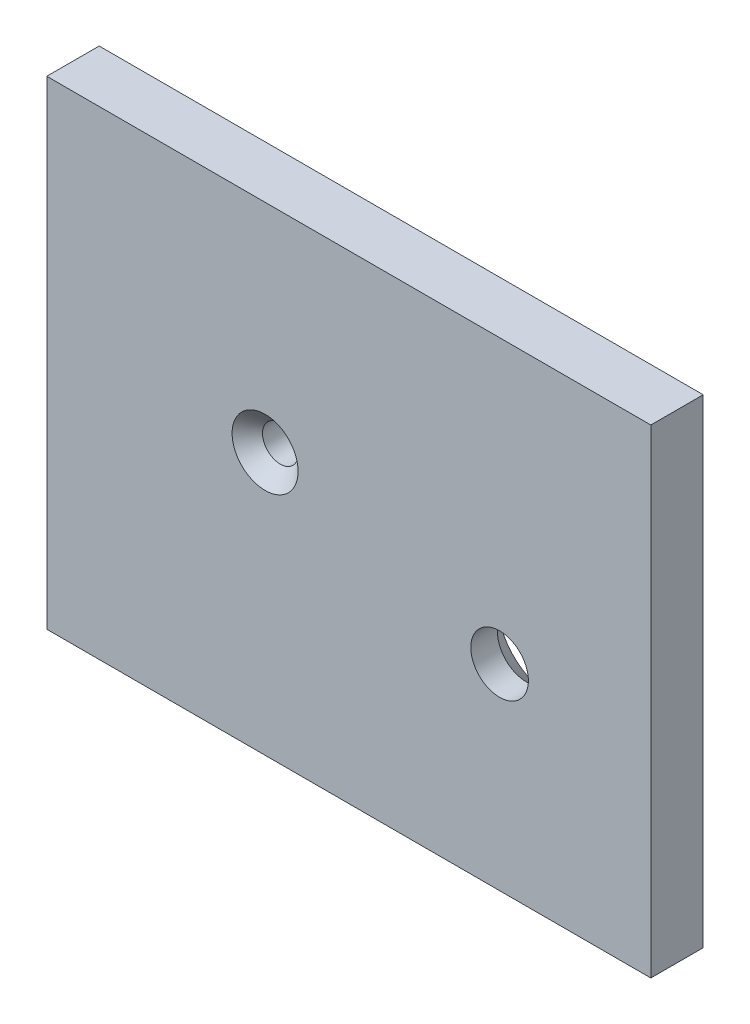
ISO-10303-21;
HEADER;
FILE_DESCRIPTION(('STEP AP214'),'2;1');
FILE_NAME('part.step','',(''),(''),'','','');
FILE_SCHEMA(('AUTOMOTIVE_DESIGN { 1 0 10303 214 1 1 1 1 }'));
ENDSEC;
DATA;
#1=APPLICATION_CONTEXT('core data for automotive mechanical design processes');
#2=APPLICATION_PROTOCOL_DEFINITION('international standard','automotive_design',2000,#1);
#3=PRODUCT_CONTEXT('',#1,'mechanical');
#4=PRODUCT('Part','Part','',(#3));
#5=PRODUCT_RELATED_PRODUCT_CATEGORY('part','',(#4));
#6=PRODUCT_DEFINITION_FORMATION('','',#4);
#7=PRODUCT_DEFINITION_CONTEXT('part definition',#1,'design');
#8=PRODUCT_DEFINITION('design','',#6,#7);
#9=PRODUCT_DEFINITION_SHAPE('','',#8);
#10=(LENGTH_UNIT() NAMED_UNIT(*) SI_UNIT(.MILLI.,.METRE.));
#11=(NAMED_UNIT(*) PLANE_ANGLE_UNIT() SI_UNIT($,.RADIAN.));
#12=(NAMED_UNIT(*) SI_UNIT($,.STERADIAN.) SOLID_ANGLE_UNIT());
#13=UNCERTAINTY_MEASURE_WITH_UNIT(LENGTH_MEASURE(1.E-05),#10,'distance_accuracy_value','');
#14=(GEOMETRIC_REPRESENTATION_CONTEXT(3) GLOBAL_UNCERTAINTY_ASSIGNED_CONTEXT((#13)) GLOBAL_UNIT_ASSIGNED_CONTEXT((#10,
#11,#12)) REPRESENTATION_CONTEXT('',''));
#15=CARTESIAN_POINT('',(0.,0.,0.));
#16=DIRECTION('',(0.,0.,1.));
#17=DIRECTION('',(1.,0.,0.));
#18=AXIS2_PLACEMENT_3D('',#15,#16,#17);
#19=CARTESIAN_POINT('',(-57.6507189630822,0.,5.));
#20=DIRECTION('',(1.,0.,0.));
#21=DIRECTION('',(0.,0.,-1.));
#22=AXIS2_PLACEMENT_3D('',#19,#20,#21);
#23=PLANE('',#22);
#24=DIRECTION('',(0.,-1.,0.));
#25=VECTOR('',#24,1.);
#26=CARTESIAN_POINT('',(-57.6507189630822,0.,0.));
#27=LINE('',#26,#25);
#28=CARTESIAN_POINT('',(-57.6507189630822,0.,0.));
#29=VERTEX_POINT('',#28);
#30=CARTESIAN_POINT('',(-57.6507189630822,-45.7094834562978,0.));
#31=VERTEX_POINT('',#30);
#32=EDGE_CURVE('E119',#29,#31,#27,.T.);
#33=ORIENTED_EDGE('',*,*,#32,.T.);
#34=DIRECTION('',(0.,0.,-1.));
#35=VECTOR('',#34,1.);
#36=CARTESIAN_POINT('',(-57.6507189630822,-45.7094834562978,5.));
#37=LINE('',#36,#35);
#38=CARTESIAN_POINT('',(-57.6507189630822,-45.7094834562978,5.));
#39=VERTEX_POINT('',#38);
#40=EDGE_CURVE('E11',#39,#31,#37,.T.);
#41=ORIENTED_EDGE('',*,*,#40,.F.);
#42=DIRECTION('',(0.,-1.,0.));
#43=VECTOR('',#42,1.);
#44=CARTESIAN_POINT('',(-57.6507189630822,0.,5.));
#45=LINE('',#44,#43);
#46=CARTESIAN_POINT('',(-57.6507189630822,0.,5.));
#47=VERTEX_POINT('',#46);
#48=EDGE_CURVE('E103',#47,#39,#45,.T.);
#49=ORIENTED_EDGE('',*,*,#48,.F.);
#50=DIRECTION('',(0.,0.,-1.));
#51=VECTOR('',#50,1.);
#52=CARTESIAN_POINT('',(-57.6507189630822,0.,5.));
#53=LINE('',#52,#51);
#54=EDGE_CURVE('E115',#47,#29,#53,.T.);
#55=ORIENTED_EDGE('',*,*,#54,.T.);
#56=EDGE_LOOP('',(#33,#41,#49,#55));
#57=FACE_BOUND('',#56,.T.);
#58=ADVANCED_FACE('F51',(#57),#23,.F.);
#59=CARTESIAN_POINT('',(-57.6507189630822,-45.7094834562978,5.));
#60=DIRECTION('',(0.,1.,0.));
#61=DIRECTION('',(0.,0.,1.));
#62=AXIS2_PLACEMENT_3D('',#59,#60,#61);
#63=PLANE('',#62);
#64=DIRECTION('',(1.,0.,0.));
#65=VECTOR('',#64,1.);
#66=CARTESIAN_POINT('',(-57.6507189630822,-45.7094834562978,0.));
#67=LINE('',#66,#65);
#68=CARTESIAN_POINT('',(0.,-45.7094834562978,0.));
#69=VERTEX_POINT('',#68);
#70=EDGE_CURVE('E108',#31,#69,#67,.T.);
#71=ORIENTED_EDGE('',*,*,#70,.T.);
#72=DIRECTION('',(0.,0.,-1.));
#73=VECTOR('',#72,1.);
#74=CARTESIAN_POINT('',(0.,-45.7094834562978,5.));
#75=LINE('',#74,#73);
#76=CARTESIAN_POINT('',(0.,-45.7094834562978,5.));
#77=VERTEX_POINT('',#76);
#78=EDGE_CURVE('E60',#77,#69,#75,.T.);
#79=ORIENTED_EDGE('',*,*,#78,.F.);
#80=DIRECTION('',(1.,0.,0.));
#81=VECTOR('',#80,1.);
#82=CARTESIAN_POINT('',(-57.6507189630822,-45.7094834562978,5.));
#83=LINE('',#82,#81);
#84=EDGE_CURVE('E98',#39,#77,#83,.T.);
#85=ORIENTED_EDGE('',*,*,#84,.F.);
#86=ORIENTED_EDGE('',*,*,#40,.T.);
#87=EDGE_LOOP('',(#71,#79,#85,#86));
#88=FACE_BOUND('',#87,.T.);
#89=ADVANCED_FACE('F107',(#88),#63,.F.);
#90=CARTESIAN_POINT('',(0.,0.,5.));
#91=DIRECTION('',(-1.,0.,0.));
#92=DIRECTION('',(0.,0.,1.));
#93=AXIS2_PLACEMENT_3D('',#90,#91,#92);
#94=PLANE('',#93);
#95=DIRECTION('',(0.,1.,0.));
#96=VECTOR('',#95,1.);
#97=CARTESIAN_POINT('',(0.,0.,0.));
#98=LINE('',#97,#96);
#99=CARTESIAN_POINT('',(0.,0.,0.));
#100=VERTEX_POINT('',#99);
#101=EDGE_CURVE('E85',#69,#100,#98,.T.);
#102=ORIENTED_EDGE('',*,*,#101,.T.);
#103=DIRECTION('',(0.,0.,-1.));
#104=VECTOR('',#103,1.);
#105=CARTESIAN_POINT('',(0.,0.,5.));
#106=LINE('',#105,#104);
#107=CARTESIAN_POINT('',(0.,0.,5.));
#108=VERTEX_POINT('',#107);
#109=EDGE_CURVE('E110',#108,#100,#106,.T.);
#110=ORIENTED_EDGE('',*,*,#109,.F.);
#111=DIRECTION('',(0.,1.,0.));
#112=VECTOR('',#111,1.);
#113=CARTESIAN_POINT('',(0.,0.,5.));
#114=LINE('',#113,#112);
#115=EDGE_CURVE('E101',#77,#108,#114,.T.);
#116=ORIENTED_EDGE('',*,*,#115,.F.);
#117=ORIENTED_EDGE('',*,*,#78,.T.);
#118=EDGE_LOOP('',(#102,#110,#116,#117));
#119=FACE_BOUND('',#118,.T.);
#120=ADVANCED_FACE('F111',(#119),#94,.F.);
#121=CARTESIAN_POINT('',(-57.6507189630822,0.,5.));
#122=DIRECTION('',(0.,-1.,0.));
#123=DIRECTION('',(0.,0.,-1.));
#124=AXIS2_PLACEMENT_3D('',#121,#122,#123);
#125=PLANE('',#124);
#126=DIRECTION('',(-1.,0.,0.));
#127=VECTOR('',#126,1.);
#128=CARTESIAN_POINT('',(-57.6507189630822,0.,0.));
#129=LINE('',#128,#127);
#130=EDGE_CURVE('E91',#100,#29,#129,.T.);
#131=ORIENTED_EDGE('',*,*,#130,.T.);
#132=ORIENTED_EDGE('',*,*,#54,.F.);
#133=DIRECTION('',(-1.,0.,0.));
#134=VECTOR('',#133,1.);
#135=CARTESIAN_POINT('',(-57.6507189630822,0.,5.));
#136=LINE('',#135,#134);
#137=EDGE_CURVE('E68',#108,#47,#136,.T.);
#138=ORIENTED_EDGE('',*,*,#137,.F.);
#139=ORIENTED_EDGE('',*,*,#109,.T.);
#140=EDGE_LOOP('',(#131,#132,#138,#139));
#141=FACE_BOUND('',#140,.T.);
#142=ADVANCED_FACE('F133',(#141),#125,.F.);
#143=CARTESIAN_POINT('',(0.,0.,5.));
#144=DIRECTION('',(0.,0.,1.));
#145=DIRECTION('',(1.,0.,0.));
#146=AXIS2_PLACEMENT_3D('',#143,#144,#145);
#147=PLANE('',#146);
#148=CARTESIAN_POINT('',(-14.434702808277,-26.9762257993717,5.));
#149=DIRECTION('',(0.,0.,-1.));
#150=DIRECTION('',(-1.,0.,0.));
#151=AXIS2_PLACEMENT_3D('',#148,#149,#150);
#152=CIRCLE('',#151,2.74999999999999);
#153=CARTESIAN_POINT('',(-17.1847028082769,-26.9762257993717,5.));
#154=VERTEX_POINT('',#153);
#155=EDGE_CURVE('E151',#154,#154,#152,.T.);
#156=ORIENTED_EDGE('',*,*,#155,.T.);
#157=EDGE_LOOP('',(#156));
#158=FACE_BOUND('',#157,.T.);
#159=CARTESIAN_POINT('',(-36.8150520665374,-20.6673619138127,5.));
#160=DIRECTION('',(0.,0.,1.));
#161=DIRECTION('',(1.,0.,0.));
#162=AXIS2_PLACEMENT_3D('',#159,#160,#161);
#163=CIRCLE('',#162,3.15);
#164=CARTESIAN_POINT('',(-33.6650520665374,-20.6673619138127,5.));
#165=VERTEX_POINT('',#164);
#166=EDGE_CURVE('E147',#165,#165,#163,.T.);
#167=ORIENTED_EDGE('',*,*,#166,.F.);
#168=EDGE_LOOP('',(#167));
#169=FACE_BOUND('',#168,.T.);
#170=ORIENTED_EDGE('',*,*,#48,.T.);
#171=ORIENTED_EDGE('',*,*,#84,.T.);
#172=ORIENTED_EDGE('',*,*,#115,.T.);
#173=ORIENTED_EDGE('',*,*,#137,.T.);
#174=EDGE_LOOP('',(#170,#171,#172,#173));
#175=FACE_BOUND('',#174,.T.);
#176=ADVANCED_FACE('F99',(#158,#169,#175),#147,.T.);
#177=CARTESIAN_POINT('',(0.,0.,0.));
#178=DIRECTION('',(0.,0.,1.));
#179=DIRECTION('',(1.,0.,0.));
#180=AXIS2_PLACEMENT_3D('',#177,#178,#179);
#181=PLANE('',#180);
#182=CARTESIAN_POINT('',(-14.434702808277,-26.9762257993717,0.));
#183=DIRECTION('',(0.,0.,-1.));
#184=DIRECTION('',(-1.,0.,0.));
#185=AXIS2_PLACEMENT_3D('',#182,#183,#184);
#186=CIRCLE('',#185,5.2);
#187=CARTESIAN_POINT('',(-19.634702808277,-26.9762257993717,0.));
#188=VERTEX_POINT('',#187);
#189=EDGE_CURVE('E159',#188,#188,#186,.T.);
#190=ORIENTED_EDGE('',*,*,#189,.F.);
#191=EDGE_LOOP('',(#190));
#192=FACE_BOUND('',#191,.T.);
#193=CARTESIAN_POINT('',(-36.8150520665374,-20.6673619138127,0.));
#194=DIRECTION('',(0.,0.,1.));
#195=DIRECTION('',(1.,0.,0.));
#196=AXIS2_PLACEMENT_3D('',#193,#194,#195);
#197=CIRCLE('',#196,1.7);
#198=CARTESIAN_POINT('',(-35.1150520665374,-20.6673619138127,0.));
#199=VERTEX_POINT('',#198);
#200=EDGE_CURVE('E123',#199,#199,#197,.T.);
#201=ORIENTED_EDGE('',*,*,#200,.T.);
#202=EDGE_LOOP('',(#201));
#203=FACE_BOUND('',#202,.T.);
#204=ORIENTED_EDGE('',*,*,#32,.F.);
#205=ORIENTED_EDGE('',*,*,#130,.F.);
#206=ORIENTED_EDGE('',*,*,#101,.F.);
#207=ORIENTED_EDGE('',*,*,#70,.F.);
#208=EDGE_LOOP('',(#204,#205,#206,#207));
#209=FACE_BOUND('',#208,.T.);
#210=ADVANCED_FACE('F136',(#192,#203,#209),#181,.F.);
#211=CARTESIAN_POINT('',(-36.8150520665374,-20.6673619138127,5.));
#212=DIRECTION('',(0.,0.,1.));
#213=DIRECTION('',(1.,0.,0.));
#214=AXIS2_PLACEMENT_3D('',#211,#212,#213);
#215=CYLINDRICAL_SURFACE('',#214,1.69999999999999);
#216=ORIENTED_EDGE('',*,*,#200,.F.);
#217=EDGE_LOOP('',(#216));
#218=FACE_BOUND('',#217,.T.);
#219=CARTESIAN_POINT('',(-36.8150520665374,-20.6673619138127,3.54999999999999));
#220=DIRECTION('',(0.,0.,1.));
#221=DIRECTION('',(1.,0.,0.));
#222=AXIS2_PLACEMENT_3D('',#219,#220,#221);
#223=CIRCLE('',#222,1.69999999999999);
#224=CARTESIAN_POINT('',(-35.1150520665374,-20.6673619138127,3.54999999999999));
#225=VERTEX_POINT('',#224);
#226=EDGE_CURVE('E143',#225,#225,#223,.T.);
#227=ORIENTED_EDGE('',*,*,#226,.T.);
#228=EDGE_LOOP('',(#227));
#229=FACE_BOUND('',#228,.T.);
#230=ADVANCED_FACE('F168',(#218,#229),#215,.F.);
#231=CARTESIAN_POINT('',(-36.8150520665374,-20.6673619138127,5.));
#232=DIRECTION('',(0.,0.,1.));
#233=DIRECTION('',(1.,0.,0.));
#234=AXIS2_PLACEMENT_3D('',#231,#232,#233);
#235=CONICAL_SURFACE('',#234,3.15,0.78539816339745);
#236=ORIENTED_EDGE('',*,*,#226,.F.);
#237=EDGE_LOOP('',(#236));
#238=FACE_BOUND('',#237,.T.);
#239=ORIENTED_EDGE('',*,*,#166,.T.);
#240=EDGE_LOOP('',(#239));
#241=FACE_BOUND('',#240,.T.);
#242=ADVANCED_FACE('F174',(#238,#241),#235,.F.);
#243=CARTESIAN_POINT('',(-14.434702808277,-26.9762257993717,0.));
#244=DIRECTION('',(0.,0.,-1.));
#245=DIRECTION('',(-1.,0.,0.));
#246=AXIS2_PLACEMENT_3D('',#243,#244,#245);
#247=CYLINDRICAL_SURFACE('',#246,2.74999999999999);
#248=ORIENTED_EDGE('',*,*,#155,.F.);
#249=EDGE_LOOP('',(#248));
#250=FACE_BOUND('',#249,.T.);
#251=CARTESIAN_POINT('',(-14.434702808277,-26.9762257993717,2.45));
#252=DIRECTION('',(0.,0.,-1.));
#253=DIRECTION('',(-1.,0.,0.));
#254=AXIS2_PLACEMENT_3D('',#251,#252,#253);
#255=CIRCLE('',#254,2.75);
#256=CARTESIAN_POINT('',(-17.184702808277,-26.9762257993717,2.45));
#257=VERTEX_POINT('',#256);
#258=EDGE_CURVE('E155',#257,#257,#255,.T.);
#259=ORIENTED_EDGE('',*,*,#258,.T.);
#260=EDGE_LOOP('',(#259));
#261=FACE_BOUND('',#260,.T.);
#262=ADVANCED_FACE('F180',(#250,#261),#247,.F.);
#263=CARTESIAN_POINT('',(-14.434702808277,-26.9762257993717,0.));
#264=DIRECTION('',(0.,0.,-1.));
#265=DIRECTION('',(-1.,0.,0.));
#266=AXIS2_PLACEMENT_3D('',#263,#264,#265);
#267=CONICAL_SURFACE('',#266,5.2,0.785398163397448);
#268=ORIENTED_EDGE('',*,*,#258,.F.);
#269=EDGE_LOOP('',(#268));
#270=FACE_BOUND('',#269,.T.);
#271=ORIENTED_EDGE('',*,*,#189,.T.);
#272=EDGE_LOOP('',(#271));
#273=FACE_BOUND('',#272,.T.);
#274=ADVANCED_FACE('F164',(#270,#273),#267,.F.);
#275=CLOSED_SHELL('',(#58,#89,#120,#142,#176,#210,#230,#242,#262,#274));
#276=MANIFOLD_SOLID_BREP('B2',#275);
#277=ADVANCED_BREP_SHAPE_REPRESENTATION('',(#18,#276),#14);
#278=SHAPE_DEFINITION_REPRESENTATION(#9,#277);
ENDSEC;
END-ISO-10303-21;
